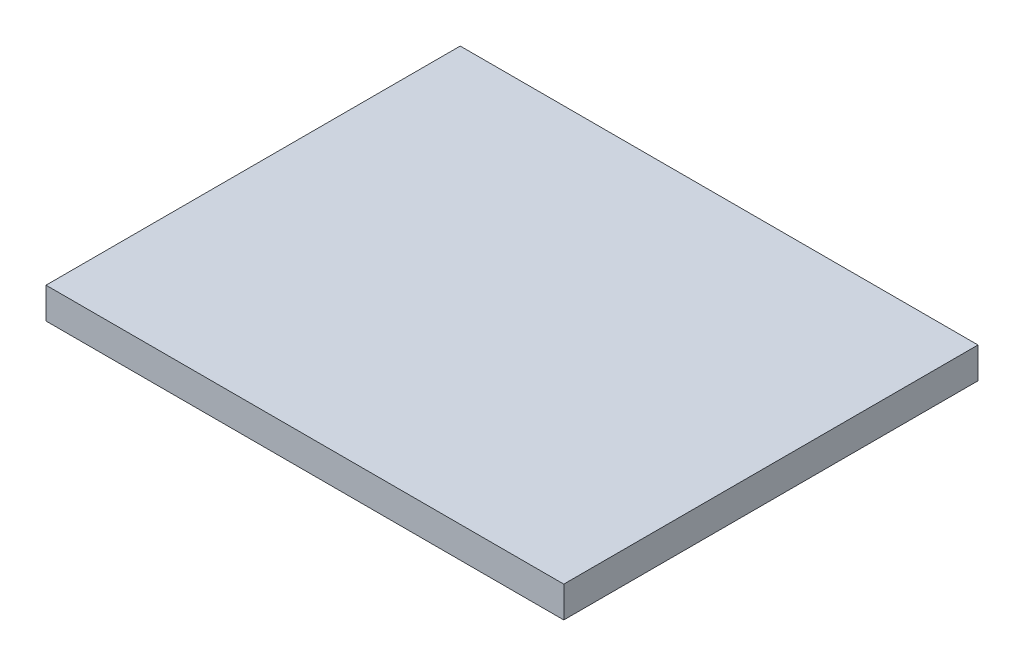
ISO-10303-21;
HEADER;
FILE_DESCRIPTION(('STEP AP214'),'2;1');
FILE_NAME('part.step','',(''),(''),'','','');
FILE_SCHEMA(('AUTOMOTIVE_DESIGN { 1 0 10303 214 1 1 1 1 }'));
ENDSEC;
DATA;
#1=APPLICATION_CONTEXT('core data for automotive mechanical design processes');
#2=APPLICATION_PROTOCOL_DEFINITION('international standard','automotive_design',2000,#1);
#3=PRODUCT_CONTEXT('',#1,'mechanical');
#4=PRODUCT('Part','Part','',(#3));
#5=PRODUCT_RELATED_PRODUCT_CATEGORY('part','',(#4));
#6=PRODUCT_DEFINITION_FORMATION('','',#4);
#7=PRODUCT_DEFINITION_CONTEXT('part definition',#1,'design');
#8=PRODUCT_DEFINITION('design','',#6,#7);
#9=PRODUCT_DEFINITION_SHAPE('','',#8);
#10=(LENGTH_UNIT() NAMED_UNIT(*) SI_UNIT(.MILLI.,.METRE.));
#11=(NAMED_UNIT(*) PLANE_ANGLE_UNIT() SI_UNIT($,.RADIAN.));
#12=(NAMED_UNIT(*) SI_UNIT($,.STERADIAN.) SOLID_ANGLE_UNIT());
#13=UNCERTAINTY_MEASURE_WITH_UNIT(LENGTH_MEASURE(1.E-05),#10,'distance_accuracy_value','');
#14=(GEOMETRIC_REPRESENTATION_CONTEXT(3) GLOBAL_UNCERTAINTY_ASSIGNED_CONTEXT((#13)) GLOBAL_UNIT_ASSIGNED_CONTEXT((#10,
#11,#12)) REPRESENTATION_CONTEXT('',''));
#15=CARTESIAN_POINT('',(0.,0.,0.));
#16=DIRECTION('',(0.,0.,1.));
#17=DIRECTION('',(1.,0.,0.));
#18=AXIS2_PLACEMENT_3D('',#15,#16,#17);
#19=CARTESIAN_POINT('',(0.,3.,0.));
#20=DIRECTION('',(1.,0.,0.));
#21=DIRECTION('',(0.,0.,-1.));
#22=AXIS2_PLACEMENT_3D('',#19,#20,#21);
#23=PLANE('',#22);
#24=DIRECTION('',(0.,0.,1.));
#25=VECTOR('',#24,1.);
#26=CARTESIAN_POINT('',(0.,0.,0.));
#27=LINE('',#26,#25);
#28=CARTESIAN_POINT('',(0.,0.,-40.));
#29=VERTEX_POINT('',#28);
#30=CARTESIAN_POINT('',(0.,0.,0.));
#31=VERTEX_POINT('',#30);
#32=EDGE_CURVE('E102',#29,#31,#27,.T.);
#33=ORIENTED_EDGE('',*,*,#32,.T.);
#34=DIRECTION('',(0.,-1.,0.));
#35=VECTOR('',#34,1.);
#36=CARTESIAN_POINT('',(0.,3.,0.));
#37=LINE('',#36,#35);
#38=CARTESIAN_POINT('',(0.,3.,0.));
#39=VERTEX_POINT('',#38);
#40=EDGE_CURVE('E11',#39,#31,#37,.T.);
#41=ORIENTED_EDGE('',*,*,#40,.F.);
#42=DIRECTION('',(0.,0.,1.));
#43=VECTOR('',#42,1.);
#44=CARTESIAN_POINT('',(0.,3.,0.));
#45=LINE('',#44,#43);
#46=CARTESIAN_POINT('',(0.,3.,-40.));
#47=VERTEX_POINT('',#46);
#48=EDGE_CURVE('E95',#47,#39,#45,.T.);
#49=ORIENTED_EDGE('',*,*,#48,.F.);
#50=DIRECTION('',(0.,-1.,0.));
#51=VECTOR('',#50,1.);
#52=CARTESIAN_POINT('',(0.,3.,-40.));
#53=LINE('',#52,#51);
#54=EDGE_CURVE('E99',#47,#29,#53,.T.);
#55=ORIENTED_EDGE('',*,*,#54,.T.);
#56=EDGE_LOOP('',(#33,#41,#49,#55));
#57=FACE_BOUND('',#56,.T.);
#58=ADVANCED_FACE('F41',(#57),#23,.F.);
#59=CARTESIAN_POINT('',(0.,3.,0.));
#60=DIRECTION('',(0.,0.,-1.));
#61=DIRECTION('',(-1.,0.,0.));
#62=AXIS2_PLACEMENT_3D('',#59,#60,#61);
#63=PLANE('',#62);
#64=DIRECTION('',(1.,0.,0.));
#65=VECTOR('',#64,1.);
#66=CARTESIAN_POINT('',(0.,0.,0.));
#67=LINE('',#66,#65);
#68=CARTESIAN_POINT('',(50.,0.,0.));
#69=VERTEX_POINT('',#68);
#70=EDGE_CURVE('E96',#31,#69,#67,.T.);
#71=ORIENTED_EDGE('',*,*,#70,.T.);
#72=DIRECTION('',(0.,-1.,0.));
#73=VECTOR('',#72,1.);
#74=CARTESIAN_POINT('',(50.,3.,0.));
#75=LINE('',#74,#73);
#76=CARTESIAN_POINT('',(50.,3.,0.));
#77=VERTEX_POINT('',#76);
#78=EDGE_CURVE('E47',#77,#69,#75,.T.);
#79=ORIENTED_EDGE('',*,*,#78,.F.);
#80=DIRECTION('',(1.,0.,0.));
#81=VECTOR('',#80,1.);
#82=CARTESIAN_POINT('',(0.,3.,0.));
#83=LINE('',#82,#81);
#84=EDGE_CURVE('E87',#39,#77,#83,.T.);
#85=ORIENTED_EDGE('',*,*,#84,.F.);
#86=ORIENTED_EDGE('',*,*,#40,.T.);
#87=EDGE_LOOP('',(#71,#79,#85,#86));
#88=FACE_BOUND('',#87,.T.);
#89=ADVANCED_FACE('F92',(#88),#63,.F.);
#90=CARTESIAN_POINT('',(50.,3.,0.));
#91=DIRECTION('',(-1.,0.,0.));
#92=DIRECTION('',(0.,0.,1.));
#93=AXIS2_PLACEMENT_3D('',#90,#91,#92);
#94=PLANE('',#93);
#95=DIRECTION('',(0.,0.,-1.));
#96=VECTOR('',#95,1.);
#97=CARTESIAN_POINT('',(50.,0.,0.));
#98=LINE('',#97,#96);
#99=CARTESIAN_POINT('',(50.,0.,-40.));
#100=VERTEX_POINT('',#99);
#101=EDGE_CURVE('E74',#69,#100,#98,.T.);
#102=ORIENTED_EDGE('',*,*,#101,.T.);
#103=DIRECTION('',(0.,-1.,0.));
#104=VECTOR('',#103,1.);
#105=CARTESIAN_POINT('',(50.,3.,-40.));
#106=LINE('',#105,#104);
#107=CARTESIAN_POINT('',(50.,3.,-40.));
#108=VERTEX_POINT('',#107);
#109=EDGE_CURVE('E100',#108,#100,#106,.T.);
#110=ORIENTED_EDGE('',*,*,#109,.F.);
#111=DIRECTION('',(0.,0.,-1.));
#112=VECTOR('',#111,1.);
#113=CARTESIAN_POINT('',(50.,3.,0.));
#114=LINE('',#113,#112);
#115=EDGE_CURVE('E89',#77,#108,#114,.T.);
#116=ORIENTED_EDGE('',*,*,#115,.F.);
#117=ORIENTED_EDGE('',*,*,#78,.T.);
#118=EDGE_LOOP('',(#102,#110,#116,#117));
#119=FACE_BOUND('',#118,.T.);
#120=ADVANCED_FACE('F98',(#119),#94,.F.);
#121=CARTESIAN_POINT('',(0.,3.,-40.));
#122=DIRECTION('',(0.,0.,1.));
#123=DIRECTION('',(1.,0.,0.));
#124=AXIS2_PLACEMENT_3D('',#121,#122,#123);
#125=PLANE('',#124);
#126=DIRECTION('',(-1.,0.,0.));
#127=VECTOR('',#126,1.);
#128=CARTESIAN_POINT('',(0.,0.,-40.));
#129=LINE('',#128,#127);
#130=EDGE_CURVE('E79',#100,#29,#129,.T.);
#131=ORIENTED_EDGE('',*,*,#130,.T.);
#132=ORIENTED_EDGE('',*,*,#54,.F.);
#133=DIRECTION('',(-1.,0.,0.));
#134=VECTOR('',#133,1.);
#135=CARTESIAN_POINT('',(0.,3.,-40.));
#136=LINE('',#135,#134);
#137=EDGE_CURVE('E60',#108,#47,#136,.T.);
#138=ORIENTED_EDGE('',*,*,#137,.F.);
#139=ORIENTED_EDGE('',*,*,#109,.T.);
#140=EDGE_LOOP('',(#131,#132,#138,#139));
#141=FACE_BOUND('',#140,.T.);
#142=ADVANCED_FACE('F112',(#141),#125,.F.);
#143=CARTESIAN_POINT('',(0.,3.,0.));
#144=DIRECTION('',(0.,-1.,0.));
#145=DIRECTION('',(0.,0.,-1.));
#146=AXIS2_PLACEMENT_3D('',#143,#144,#145);
#147=PLANE('',#146);
#148=ORIENTED_EDGE('',*,*,#48,.T.);
#149=ORIENTED_EDGE('',*,*,#84,.T.);
#150=ORIENTED_EDGE('',*,*,#115,.T.);
#151=ORIENTED_EDGE('',*,*,#137,.T.);
#152=EDGE_LOOP('',(#148,#149,#150,#151));
#153=FACE_BOUND('',#152,.T.);
#154=ADVANCED_FACE('F86',(#153),#147,.F.);
#155=CARTESIAN_POINT('',(0.,0.,0.));
#156=DIRECTION('',(0.,-1.,0.));
#157=DIRECTION('',(0.,0.,-1.));
#158=AXIS2_PLACEMENT_3D('',#155,#156,#157);
#159=PLANE('',#158);
#160=ORIENTED_EDGE('',*,*,#32,.F.);
#161=ORIENTED_EDGE('',*,*,#130,.F.);
#162=ORIENTED_EDGE('',*,*,#101,.F.);
#163=ORIENTED_EDGE('',*,*,#70,.F.);
#164=EDGE_LOOP('',(#160,#161,#162,#163));
#165=FACE_BOUND('',#164,.T.);
#166=ADVANCED_FACE('F111',(#165),#159,.T.);
#167=CLOSED_SHELL('',(#58,#89,#120,#142,#154,#166));
#168=MANIFOLD_SOLID_BREP('B2',#167);
#169=ADVANCED_BREP_SHAPE_REPRESENTATION('',(#18,#168),#14);
#170=SHAPE_DEFINITION_REPRESENTATION(#9,#169);
ENDSEC;
END-ISO-10303-21;
